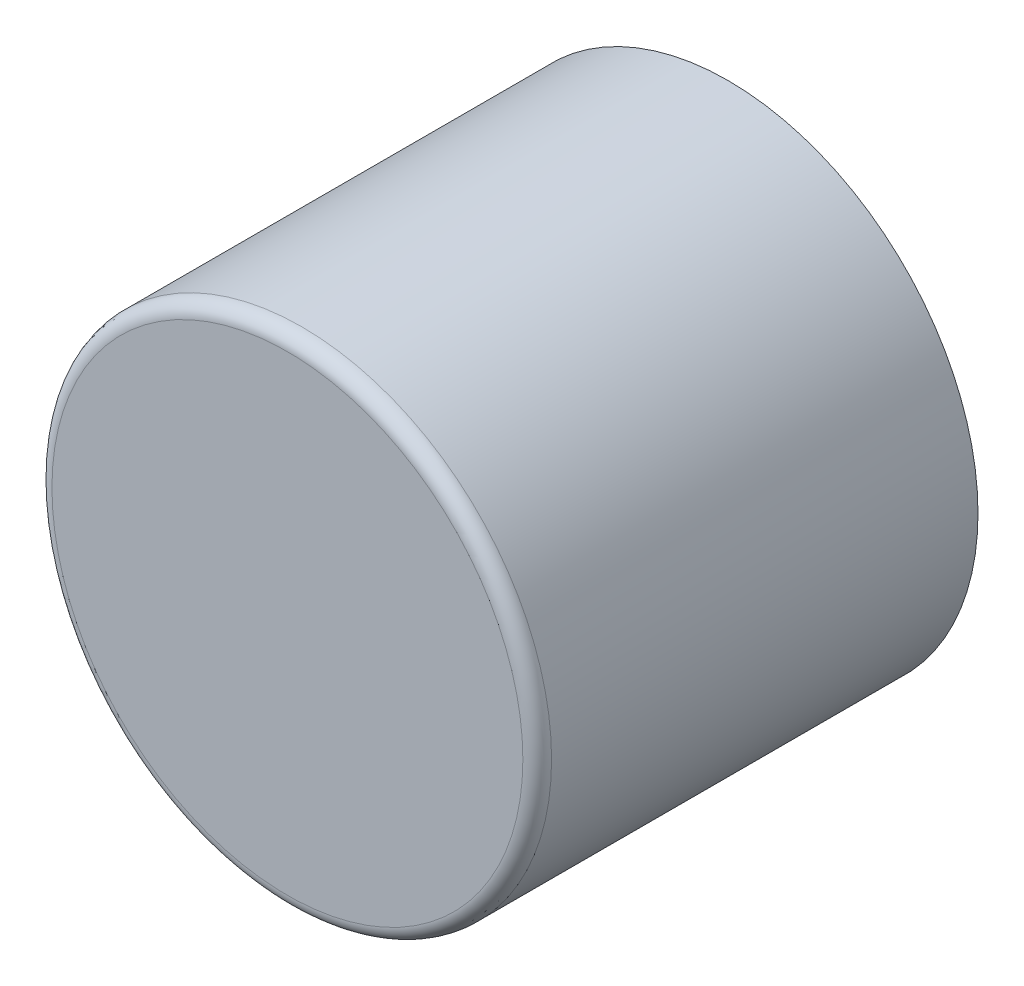
ISO-10303-21;
HEADER;
FILE_DESCRIPTION(('STEP AP214'),'2;1');
FILE_NAME('part.step','',(''),(''),'','','');
FILE_SCHEMA(('AUTOMOTIVE_DESIGN { 1 0 10303 214 1 1 1 1 }'));
ENDSEC;
DATA;
#1=APPLICATION_CONTEXT('core data for automotive mechanical design processes');
#2=APPLICATION_PROTOCOL_DEFINITION('international standard','automotive_design',2000,#1);
#3=PRODUCT_CONTEXT('',#1,'mechanical');
#4=PRODUCT('Part','Part','',(#3));
#5=PRODUCT_RELATED_PRODUCT_CATEGORY('part','',(#4));
#6=PRODUCT_DEFINITION_FORMATION('','',#4);
#7=PRODUCT_DEFINITION_CONTEXT('part definition',#1,'design');
#8=PRODUCT_DEFINITION('design','',#6,#7);
#9=PRODUCT_DEFINITION_SHAPE('','',#8);
#10=(LENGTH_UNIT() NAMED_UNIT(*) SI_UNIT(.MILLI.,.METRE.));
#11=(NAMED_UNIT(*) PLANE_ANGLE_UNIT() SI_UNIT($,.RADIAN.));
#12=(NAMED_UNIT(*) SI_UNIT($,.STERADIAN.) SOLID_ANGLE_UNIT());
#13=UNCERTAINTY_MEASURE_WITH_UNIT(LENGTH_MEASURE(1.E-05),#10,'distance_accuracy_value','');
#14=(GEOMETRIC_REPRESENTATION_CONTEXT(3) GLOBAL_UNCERTAINTY_ASSIGNED_CONTEXT((#13)) GLOBAL_UNIT_ASSIGNED_CONTEXT((#10,
#11,#12)) REPRESENTATION_CONTEXT('',''));
#15=CARTESIAN_POINT('',(0.,0.,0.));
#16=DIRECTION('',(0.,0.,1.));
#17=DIRECTION('',(1.,0.,0.));
#18=AXIS2_PLACEMENT_3D('',#15,#16,#17);
#19=CARTESIAN_POINT('',(0.,0.,30.7));
#20=DIRECTION('',(0.,0.,-1.));
#21=DIRECTION('',(-1.,0.,0.));
#22=AXIS2_PLACEMENT_3D('',#19,#20,#21);
#23=CYLINDRICAL_SURFACE('',#22,17.4);
#24=CARTESIAN_POINT('',(0.,0.,29.7));
#25=DIRECTION('',(0.,0.,1.));
#26=DIRECTION('',(1.,0.,0.));
#27=AXIS2_PLACEMENT_3D('',#24,#25,#26);
#28=CIRCLE('',#27,17.4);
#29=CARTESIAN_POINT('',(17.4,0.,29.7));
#30=VERTEX_POINT('',#29);
#31=EDGE_CURVE('E10',#30,#30,#28,.F.);
#32=ORIENTED_EDGE('',*,*,#31,.T.);
#33=EDGE_LOOP('',(#32));
#34=FACE_BOUND('',#33,.T.);
#35=CARTESIAN_POINT('',(0.,0.,0.));
#36=DIRECTION('',(0.,0.,1.));
#37=DIRECTION('',(1.,0.,0.));
#38=AXIS2_PLACEMENT_3D('',#35,#36,#37);
#39=CIRCLE('',#38,17.4);
#40=CARTESIAN_POINT('',(17.4,0.,0.));
#41=VERTEX_POINT('',#40);
#42=EDGE_CURVE('E50',#41,#41,#39,.T.);
#43=ORIENTED_EDGE('',*,*,#42,.T.);
#44=EDGE_LOOP('',(#43));
#45=FACE_BOUND('',#44,.T.);
#46=ADVANCED_FACE('F37',(#34,#45),#23,.T.);
#47=CARTESIAN_POINT('',(0.,0.,30.7));
#48=DIRECTION('',(0.,0.,1.));
#49=DIRECTION('',(1.,0.,0.));
#50=AXIS2_PLACEMENT_3D('',#47,#48,#49);
#51=PLANE('',#50);
#52=CARTESIAN_POINT('',(0.,0.,30.7));
#53=DIRECTION('',(0.,0.,1.));
#54=DIRECTION('',(1.,0.,0.));
#55=AXIS2_PLACEMENT_3D('',#52,#53,#54);
#56=CIRCLE('',#55,16.4);
#57=CARTESIAN_POINT('',(16.4,0.,30.7));
#58=VERTEX_POINT('',#57);
#59=EDGE_CURVE('E45',#58,#58,#56,.T.);
#60=ORIENTED_EDGE('',*,*,#59,.T.);
#61=EDGE_LOOP('',(#60));
#62=FACE_BOUND('',#61,.T.);
#63=ADVANCED_FACE('F61',(#62),#51,.T.);
#64=CARTESIAN_POINT('',(0.,0.,0.));
#65=DIRECTION('',(0.,0.,1.));
#66=DIRECTION('',(1.,0.,0.));
#67=AXIS2_PLACEMENT_3D('',#64,#65,#66);
#68=PLANE('',#67);
#69=ORIENTED_EDGE('',*,*,#42,.F.);
#70=EDGE_LOOP('',(#69));
#71=FACE_BOUND('',#70,.T.);
#72=ADVANCED_FACE('F59',(#71),#68,.F.);
#73=CARTESIAN_POINT('',(0.,0.,29.7));
#74=DIRECTION('',(0.,0.,1.));
#75=DIRECTION('',(1.,0.,0.));
#76=AXIS2_PLACEMENT_3D('',#73,#74,#75);
#77=TOROIDAL_SURFACE('',#76,16.4,1.);
#78=ORIENTED_EDGE('',*,*,#31,.F.);
#79=EDGE_LOOP('',(#78));
#80=FACE_BOUND('',#79,.T.);
#81=ORIENTED_EDGE('',*,*,#59,.F.);
#82=EDGE_LOOP('',(#81));
#83=FACE_BOUND('',#82,.T.);
#84=ADVANCED_FACE('F39',(#80,#83),#77,.T.);
#85=CLOSED_SHELL('',(#46,#63,#72,#84));
#86=MANIFOLD_SOLID_BREP('B2',#85);
#87=ADVANCED_BREP_SHAPE_REPRESENTATION('',(#18,#86),#14);
#88=SHAPE_DEFINITION_REPRESENTATION(#9,#87);
ENDSEC;
END-ISO-10303-21;
